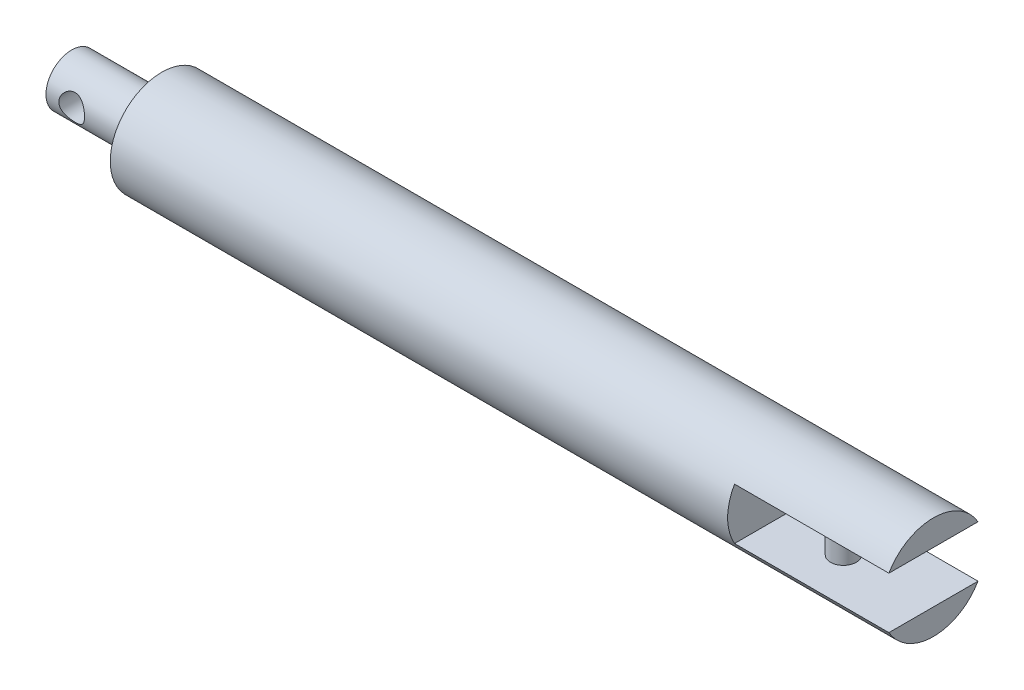
ISO-10303-21;
HEADER;
FILE_DESCRIPTION(('STEP AP214'),'2;1');
FILE_NAME('part.step','',(''),(''),'','','');
FILE_SCHEMA(('AUTOMOTIVE_DESIGN { 1 0 10303 214 1 1 1 1 }'));
ENDSEC;
DATA;
#1=APPLICATION_CONTEXT('core data for automotive mechanical design processes');
#2=APPLICATION_PROTOCOL_DEFINITION('international standard','automotive_design',2000,#1);
#3=PRODUCT_CONTEXT('',#1,'mechanical');
#4=PRODUCT('Part','Part','',(#3));
#5=PRODUCT_RELATED_PRODUCT_CATEGORY('part','',(#4));
#6=PRODUCT_DEFINITION_FORMATION('','',#4);
#7=PRODUCT_DEFINITION_CONTEXT('part definition',#1,'design');
#8=PRODUCT_DEFINITION('design','',#6,#7);
#9=PRODUCT_DEFINITION_SHAPE('','',#8);
#10=(LENGTH_UNIT() NAMED_UNIT(*) SI_UNIT(.MILLI.,.METRE.));
#11=(NAMED_UNIT(*) PLANE_ANGLE_UNIT() SI_UNIT($,.RADIAN.));
#12=(NAMED_UNIT(*) SI_UNIT($,.STERADIAN.) SOLID_ANGLE_UNIT());
#13=UNCERTAINTY_MEASURE_WITH_UNIT(LENGTH_MEASURE(1.E-05),#10,'distance_accuracy_value','');
#14=(GEOMETRIC_REPRESENTATION_CONTEXT(3) GLOBAL_UNCERTAINTY_ASSIGNED_CONTEXT((#13)) GLOBAL_UNIT_ASSIGNED_CONTEXT((#10,
#11,#12)) REPRESENTATION_CONTEXT('',''));
#15=CARTESIAN_POINT('',(0.,0.,0.));
#16=DIRECTION('',(0.,0.,1.));
#17=DIRECTION('',(1.,0.,0.));
#18=AXIS2_PLACEMENT_3D('',#15,#16,#17);
#19=CARTESIAN_POINT('',(67.,0.,0.));
#20=DIRECTION('',(1.,0.,0.));
#21=DIRECTION('',(0.,0.,-1.));
#22=AXIS2_PLACEMENT_3D('',#19,#20,#21);
#23=PLANE('',#22);
#24=DIRECTION('',(0.,0.,1.));
#25=VECTOR('',#24,1.);
#26=CARTESIAN_POINT('',(67.,2.,0.));
#27=LINE('',#26,#25);
#28=CARTESIAN_POINT('',(67.,2.,-3.46410161513775));
#29=VERTEX_POINT('',#28);
#30=CARTESIAN_POINT('',(67.,2.,3.46410161513775));
#31=VERTEX_POINT('',#30);
#32=EDGE_CURVE('E83',#29,#31,#27,.T.);
#33=ORIENTED_EDGE('',*,*,#32,.F.);
#34=CARTESIAN_POINT('',(67.,0.,0.));
#35=DIRECTION('',(1.,0.,0.));
#36=DIRECTION('',(0.,0.,-1.));
#37=AXIS2_PLACEMENT_3D('',#34,#35,#36);
#38=CIRCLE('',#37,4.);
#39=EDGE_CURVE('E97',#29,#31,#38,.T.);
#40=ORIENTED_EDGE('',*,*,#39,.T.);
#41=EDGE_LOOP('',(#33,#40));
#42=FACE_BOUND('',#41,.T.);
#43=ADVANCED_FACE('F34',(#42),#23,.T.);
#44=CARTESIAN_POINT('',(7.,0.,0.));
#45=DIRECTION('',(-1.,0.,0.));
#46=DIRECTION('',(0.,0.,1.));
#47=AXIS2_PLACEMENT_3D('',#44,#45,#46);
#48=CYLINDRICAL_SURFACE('',#47,2.);
#49=CARTESIAN_POINT('',(3.,0.,-2.));
#50=CARTESIAN_POINT('',(2.9999966976805,0.0525719629529865,-1.99999713404151));
#51=CARTESIAN_POINT('',(2.99582992687833,0.105206599698033,-1.99790491019518));
#52=CARTESIAN_POINT('',(2.97934711965908,0.208920235268425,-1.98974156037396));
#53=CARTESIAN_POINT('',(2.96701560700235,0.259996086713504,-1.98366287828984));
#54=CARTESIAN_POINT('',(2.93480619138321,0.358933544880574,-1.96816279403312));
#55=CARTESIAN_POINT('',(2.91495761575199,0.40680680293918,-1.9587543917752));
#56=CARTESIAN_POINT('',(2.86842937863506,0.498472616806565,-1.93745776515779));
#57=CARTESIAN_POINT('',(2.84175025575115,0.54226549399005,-1.9255697363353));
#58=CARTESIAN_POINT('',(2.7804827505147,0.627507817761919,-1.89956258258057));
#59=CARTESIAN_POINT('',(2.74551352076036,0.668655211122112,-1.88535199127536));
#60=CARTESIAN_POINT('',(2.66947852075297,0.744779444866977,-1.85659970246744));
#61=CARTESIAN_POINT('',(2.62840814822756,0.779751583106767,-1.84205776209035));
#62=CARTESIAN_POINT('',(2.53751665047662,0.845252000450279,-1.81298951197347));
#63=CARTESIAN_POINT('',(2.48726390165409,0.875225335551638,-1.79855186970132));
#64=CARTESIAN_POINT('',(2.38163266401378,0.926168226890696,-1.77285978772321));
#65=CARTESIAN_POINT('',(2.32625787127725,0.947144214966334,-1.7616030760699));
#66=CARTESIAN_POINT('',(2.21533489457808,0.978132442188589,-1.74457867037809));
#67=CARTESIAN_POINT('',(2.15999554793261,0.988725857080441,-1.73852271583714));
#68=CARTESIAN_POINT('',(2.04802116222052,1.00042699330885,-1.73181889948528));
#69=CARTESIAN_POINT('',(1.99138745912885,1.00154408837307,-1.73116569343288));
#70=CARTESIAN_POINT('',(1.88571397568463,0.994687287172295,-1.73510930257249));
#71=CARTESIAN_POINT('',(1.83657596877695,0.987784559536822,-1.73908763662014));
#72=CARTESIAN_POINT('',(1.74027809062696,0.966939849056932,-1.7507622873385));
#73=CARTESIAN_POINT('',(1.69311885469468,0.952995623897652,-1.75845978831776));
#74=CARTESIAN_POINT('',(1.60077086743434,0.918209780386004,-1.77687476412741));
#75=CARTESIAN_POINT('',(1.55565360121421,0.897215067115995,-1.78765840663999));
#76=CARTESIAN_POINT('',(1.46936570740999,0.849041687668003,-1.81103404281404));
#77=CARTESIAN_POINT('',(1.42819686439991,0.821860243812468,-1.82362684780191));
#78=CARTESIAN_POINT('',(1.34547874725677,0.758066054912789,-1.85113157903286));
#79=CARTESIAN_POINT('',(1.30454312642384,0.720694458369282,-1.86613510236746));
#80=CARTESIAN_POINT('',(1.2292645814091,0.639555578741374,-1.89547623300407));
#81=CARTESIAN_POINT('',(1.19492480796612,0.595785256574285,-1.90981351958801));
#82=CARTESIAN_POINT('',(1.13231433897027,0.500516505831848,-1.93701987282964));
#83=CARTESIAN_POINT('',(1.10439952755426,0.448753591599409,-1.94978984162008));
#84=CARTESIAN_POINT('',(1.05790297095699,0.340466215488797,-1.97157881121242));
#85=CARTESIAN_POINT('',(1.03931381498483,0.283945576265276,-1.98060078943553));
#86=CARTESIAN_POINT('',(1.01352459628332,0.172766491660702,-1.99324333741436));
#87=CARTESIAN_POINT('',(1.00550876425322,0.118341530548324,-1.99724938301312));
#88=CARTESIAN_POINT('',(0.99853526886551,0.00877959994935363,-2.00073013459102));
#89=CARTESIAN_POINT('',(0.999573314360521,-0.0463570198699014,-2.00020698721312));
#90=CARTESIAN_POINT('',(1.01020668841875,-0.151232971985994,-1.99491192253441));
#91=CARTESIAN_POINT('',(1.01913253273003,-0.201059408049954,-1.9904724568819));
#92=CARTESIAN_POINT('',(1.04423807189509,-0.298406892301917,-1.97822171314819));
#93=CARTESIAN_POINT('',(1.06041856645336,-0.345927685690997,-1.97041006334333));
#94=CARTESIAN_POINT('',(1.09999846643317,-0.438888608449665,-1.9518425141367));
#95=CARTESIAN_POINT('',(1.12359105011681,-0.484230397006154,-1.94100881769939));
#96=CARTESIAN_POINT('',(1.17710753564604,-0.570461361698921,-1.91743974317109));
#97=CARTESIAN_POINT('',(1.20703413459343,-0.611348629775282,-1.90470355565785));
#98=CARTESIAN_POINT('',(1.27576042533287,-0.691767689290653,-1.87708221337465));
#99=CARTESIAN_POINT('',(1.31514286845356,-0.730772077824639,-1.86210884848441));
#100=CARTESIAN_POINT('',(1.3999251512693,-0.80185632111324,-1.83262391603875));
#101=CARTESIAN_POINT('',(1.44532911881637,-0.833931385690841,-1.81811267381527));
#102=CARTESIAN_POINT('',(1.54364365420031,-0.891707914497696,-1.79051192226068));
#103=CARTESIAN_POINT('',(1.59681126620859,-0.917025495878638,-1.77752529663472));
#104=CARTESIAN_POINT('',(1.70751006769252,-0.958082826013803,-1.75574072368126));
#105=CARTESIAN_POINT('',(1.76503552650119,-0.97383491588757,-1.74693738240618));
#106=CARTESIAN_POINT('',(1.87691022286145,-0.993861687449679,-1.73561501008667));
#107=CARTESIAN_POINT('',(1.93103425342904,-0.999092996400865,-1.73257383460491));
#108=CARTESIAN_POINT('',(2.03944706717073,-1.00068915438079,-1.73165354646175));
#109=CARTESIAN_POINT('',(2.09373576873943,-0.997057846624399,-1.73377219627553));
#110=CARTESIAN_POINT('',(2.19548350153202,-0.981926125592263,-1.74237862050025));
#111=CARTESIAN_POINT('',(2.2431004701444,-0.971208314342799,-1.74843094482394));
#112=CARTESIAN_POINT('',(2.33580811942471,-0.943175358224645,-1.76371016187918));
#113=CARTESIAN_POINT('',(2.38089798209197,-0.92585809115981,-1.77293807569676));
#114=CARTESIAN_POINT('',(2.47062485098661,-0.883815745300683,-1.79428530364528));
#115=CARTESIAN_POINT('',(2.5150279018297,-0.858671137816458,-1.80655722396191));
#116=CARTESIAN_POINT('',(2.59927453618059,-0.802150971636634,-1.8323533163459));
#117=CARTESIAN_POINT('',(2.63911573051849,-0.770772171238648,-1.84587813794522));
#118=CARTESIAN_POINT('',(2.71814198235762,-0.698203326664641,-1.87462323159313));
#119=CARTESIAN_POINT('',(2.75665910236192,-0.656284423010171,-1.88984983311469));
#120=CARTESIAN_POINT('',(2.82626298342363,-0.56615480622028,-1.91877752255088));
#121=CARTESIAN_POINT('',(2.85734573942629,-0.517940723256785,-1.9324777860804));
#122=CARTESIAN_POINT('',(2.9112363627622,-0.415931596819947,-1.95698009585103));
#123=CARTESIAN_POINT('',(2.93398416941143,-0.362099503934614,-1.96776096562909));
#124=CARTESIAN_POINT('',(2.96980816791895,-0.250742101294191,-1.98501341363466));
#125=CARTESIAN_POINT('',(2.98291184682958,-0.193227799623166,-1.99149723372932));
#126=CARTESIAN_POINT('',(2.99389741107585,-0.112601946483384,-1.99695461909663));
#127=CARTESIAN_POINT('',(2.99618264086362,-0.0901618794394987,-1.99809365339202));
#128=CARTESIAN_POINT('',(2.99923466551681,-0.0451517318071577,-1.99961696977865));
#129=CARTESIAN_POINT('',(3.0000014184712,-0.0225816476473814,-2.00000123103763));
#130=CARTESIAN_POINT('',(3.,0.,-2.));
#131=B_SPLINE_CURVE_WITH_KNOTS('',3,(#49,#50,#51,#52,#53,#54,#55,#56,#57,#58,#59,#60,#61,#62,
#63,#64,#65,#66,#67,#68,#69,#70,#71,#72,#73,#74,#75,#76,#77,#78,#79,#80,#81,#82,#83,#84,#85,#86,
#87,#88,#89,#90,#91,#92,#93,#94,#95,#96,#97,#98,#99,#100,#101,#102,#103,#104,#105,#106,#107,
#108,#109,#110,#111,#112,#113,#114,#115,#116,#117,#118,#119,#120,#121,#122,#123,#124,#125,#126,
#127,#128,#129,#130),.UNSPECIFIED.,.T.,.F.,(4,2,2,2,2,2,2,2,2,2,2,2,2,2,2,2,2,2,2,2,2,2,2,2,2,2,
2,2,2,2,2,2,2,2,2,2,2,2,2,2,4),(0.,0.157624257420293,0.315548149709198,0.472862155492298,
0.630163760581568,0.796981758718089,0.963926237654036,1.14381726430753,1.32357947898281,
1.4925801214023,1.6614135732902,1.81005712409321,1.95874803925678,2.11090240168487,
2.26312521260222,2.43464941333878,2.60625534598686,2.78583022214441,2.9652621691228,
3.12983290471346,3.29432564511476,3.44606906506122,3.59782921630932,3.75392856027899,
3.91009450748339,4.08159610644419,4.25321588615432,4.43314682159674,4.61284511940778,
4.77529307498373,4.93767059860005,5.08457930244183,5.23153528783678,5.38836456775614,
5.54527561138958,5.72125242752498,5.89732383376573,6.07464013662925,6.2514490862493,
6.31915280137698,6.38685838514847),.UNSPECIFIED.);
#132=CARTESIAN_POINT('',(3.,0.,-2.));
#133=VERTEX_POINT('',#132);
#134=EDGE_CURVE('E84',#133,#133,#131,.T.);
#135=ORIENTED_EDGE('',*,*,#134,.T.);
#136=EDGE_LOOP('',(#135));
#137=FACE_BOUND('',#136,.T.);
#138=CARTESIAN_POINT('',(3.,0.,2.));
#139=CARTESIAN_POINT('',(2.9999966976805,-0.0525719629529866,1.99999713404151));
#140=CARTESIAN_POINT('',(2.99582992687833,-0.105206599698033,1.99790491019518));
#141=CARTESIAN_POINT('',(2.97934711965908,-0.208920235268425,1.98974156037396));
#142=CARTESIAN_POINT('',(2.96701560700235,-0.259996086713504,1.98366287828984));
#143=CARTESIAN_POINT('',(2.93480619138321,-0.358933544880574,1.96816279403312));
#144=CARTESIAN_POINT('',(2.91495761575199,-0.40680680293918,1.9587543917752));
#145=CARTESIAN_POINT('',(2.86842937863506,-0.498472616806565,1.93745776515779));
#146=CARTESIAN_POINT('',(2.84175025575115,-0.54226549399005,1.9255697363353));
#147=CARTESIAN_POINT('',(2.7804827505147,-0.627507817761919,1.89956258258057));
#148=CARTESIAN_POINT('',(2.74551352076036,-0.668655211122112,1.88535199127536));
#149=CARTESIAN_POINT('',(2.66947852075297,-0.744779444866977,1.85659970246744));
#150=CARTESIAN_POINT('',(2.62840814822756,-0.779751583106767,1.84205776209035));
#151=CARTESIAN_POINT('',(2.53751665047662,-0.845252000450279,1.81298951197347));
#152=CARTESIAN_POINT('',(2.48726390165409,-0.875225335551638,1.79855186970132));
#153=CARTESIAN_POINT('',(2.38163266401379,-0.926168226890696,1.77285978772321));
#154=CARTESIAN_POINT('',(2.32625787127725,-0.947144214966334,1.7616030760699));
#155=CARTESIAN_POINT('',(2.21533489457808,-0.978132442188589,1.74457867037809));
#156=CARTESIAN_POINT('',(2.15999554793261,-0.988725857080441,1.73852271583714));
#157=CARTESIAN_POINT('',(2.04802116222052,-1.00042699330885,1.73181889948528));
#158=CARTESIAN_POINT('',(1.99138745912885,-1.00154408837307,1.73116569343288));
#159=CARTESIAN_POINT('',(1.88571397568463,-0.994687287172295,1.73510930257249));
#160=CARTESIAN_POINT('',(1.83657596877695,-0.987784559536822,1.73908763662014));
#161=CARTESIAN_POINT('',(1.74027809062696,-0.966939849056932,1.7507622873385));
#162=CARTESIAN_POINT('',(1.69311885469468,-0.952995623897652,1.75845978831776));
#163=CARTESIAN_POINT('',(1.60077086743434,-0.918209780386004,1.77687476412741));
#164=CARTESIAN_POINT('',(1.55565360121421,-0.897215067115995,1.78765840663999));
#165=CARTESIAN_POINT('',(1.46936570740999,-0.849041687668003,1.81103404281404));
#166=CARTESIAN_POINT('',(1.42819686439991,-0.821860243812468,1.82362684780191));
#167=CARTESIAN_POINT('',(1.34547874725677,-0.758066054912789,1.85113157903286));
#168=CARTESIAN_POINT('',(1.30454312642384,-0.720694458369282,1.86613510236746));
#169=CARTESIAN_POINT('',(1.2292645814091,-0.639555578741373,1.89547623300407));
#170=CARTESIAN_POINT('',(1.19492480796612,-0.595785256574285,1.90981351958801));
#171=CARTESIAN_POINT('',(1.13231433897027,-0.500516505831848,1.93701987282964));
#172=CARTESIAN_POINT('',(1.10439952755426,-0.448753591599409,1.94978984162008));
#173=CARTESIAN_POINT('',(1.05790297095699,-0.340466215488797,1.97157881121242));
#174=CARTESIAN_POINT('',(1.03931381498483,-0.283945576265276,1.98060078943553));
#175=CARTESIAN_POINT('',(1.01352459628332,-0.172766491660702,1.99324333741436));
#176=CARTESIAN_POINT('',(1.00550876425322,-0.118341530548324,1.99724938301312));
#177=CARTESIAN_POINT('',(0.99853526886551,-0.00877959994935378,2.00073013459102));
#178=CARTESIAN_POINT('',(0.999573314360521,0.0463570198699013,2.00020698721312));
#179=CARTESIAN_POINT('',(1.01020668841875,0.151232971985994,1.99491192253441));
#180=CARTESIAN_POINT('',(1.01913253273003,0.201059408049954,1.9904724568819));
#181=CARTESIAN_POINT('',(1.04423807189509,0.298406892301917,1.97822171314819));
#182=CARTESIAN_POINT('',(1.06041856645336,0.345927685690997,1.97041006334333));
#183=CARTESIAN_POINT('',(1.09999846643317,0.438888608449665,1.9518425141367));
#184=CARTESIAN_POINT('',(1.12359105011681,0.484230397006154,1.94100881769939));
#185=CARTESIAN_POINT('',(1.17710753564604,0.570461361698921,1.91743974317109));
#186=CARTESIAN_POINT('',(1.20703413459343,0.611348629775282,1.90470355565785));
#187=CARTESIAN_POINT('',(1.27576042533287,0.691767689290653,1.87708221337465));
#188=CARTESIAN_POINT('',(1.31514286845356,0.730772077824639,1.86210884848441));
#189=CARTESIAN_POINT('',(1.3999251512693,0.80185632111324,1.83262391603875));
#190=CARTESIAN_POINT('',(1.44532911881637,0.833931385690841,1.81811267381527));
#191=CARTESIAN_POINT('',(1.54364365420031,0.891707914497696,1.79051192226068));
#192=CARTESIAN_POINT('',(1.59681126620859,0.917025495878638,1.77752529663472));
#193=CARTESIAN_POINT('',(1.70751006769252,0.958082826013803,1.75574072368126));
#194=CARTESIAN_POINT('',(1.76503552650119,0.97383491588757,1.74693738240618));
#195=CARTESIAN_POINT('',(1.87691022286145,0.993861687449679,1.73561501008667));
#196=CARTESIAN_POINT('',(1.93103425342904,0.999092996400865,1.73257383460491));
#197=CARTESIAN_POINT('',(2.03944706717073,1.00068915438079,1.73165354646175));
#198=CARTESIAN_POINT('',(2.09373576873943,0.997057846624399,1.73377219627553));
#199=CARTESIAN_POINT('',(2.19548350153202,0.981926125592263,1.74237862050025));
#200=CARTESIAN_POINT('',(2.2431004701444,0.971208314342799,1.74843094482394));
#201=CARTESIAN_POINT('',(2.33580811942471,0.943175358224645,1.76371016187918));
#202=CARTESIAN_POINT('',(2.38089798209197,0.92585809115981,1.77293807569676));
#203=CARTESIAN_POINT('',(2.47062485098661,0.883815745300683,1.79428530364528));
#204=CARTESIAN_POINT('',(2.5150279018297,0.858671137816458,1.80655722396191));
#205=CARTESIAN_POINT('',(2.59927453618059,0.802150971636634,1.8323533163459));
#206=CARTESIAN_POINT('',(2.63911573051849,0.770772171238648,1.84587813794522));
#207=CARTESIAN_POINT('',(2.71814198235762,0.698203326664641,1.87462323159313));
#208=CARTESIAN_POINT('',(2.75665910236192,0.656284423010171,1.88984983311469));
#209=CARTESIAN_POINT('',(2.82626298342363,0.56615480622028,1.91877752255088));
#210=CARTESIAN_POINT('',(2.85734573942629,0.517940723256785,1.9324777860804));
#211=CARTESIAN_POINT('',(2.9112363627622,0.415931596819947,1.95698009585103));
#212=CARTESIAN_POINT('',(2.93398416941143,0.362099503934614,1.96776096562909));
#213=CARTESIAN_POINT('',(2.96980816791895,0.250742101294191,1.98501341363466));
#214=CARTESIAN_POINT('',(2.98291184682958,0.193227799623166,1.99149723372932));
#215=CARTESIAN_POINT('',(2.99389741107585,0.112601946483384,1.99695461909663));
#216=CARTESIAN_POINT('',(2.99618264086362,0.0901618794394987,1.99809365339202));
#217=CARTESIAN_POINT('',(2.99923466551681,0.0451517318071577,1.99961696977865));
#218=CARTESIAN_POINT('',(3.0000014184712,0.0225816476473814,2.00000123103763));
#219=CARTESIAN_POINT('',(3.,0.,2.));
#220=B_SPLINE_CURVE_WITH_KNOTS('',3,(#138,#139,#140,#141,#142,#143,#144,#145,#146,#147,#148,
#149,#150,#151,#152,#153,#154,#155,#156,#157,#158,#159,#160,#161,#162,#163,#164,#165,#166,#167,
#168,#169,#170,#171,#172,#173,#174,#175,#176,#177,#178,#179,#180,#181,#182,#183,#184,#185,#186,
#187,#188,#189,#190,#191,#192,#193,#194,#195,#196,#197,#198,#199,#200,#201,#202,#203,#204,#205,
#206,#207,#208,#209,#210,#211,#212,#213,#214,#215,#216,#217,#218,#219),.UNSPECIFIED.,.T.,.F.,(4,
2,2,2,2,2,2,2,2,2,2,2,2,2,2,2,2,2,2,2,2,2,2,2,2,2,2,2,2,2,2,2,2,2,2,2,2,2,2,2,4),(0.,
0.157624257420293,0.315548149709198,0.472862155492298,0.630163760581568,0.796981758718089,
0.963926237654035,1.14381726430753,1.32357947898281,1.4925801214023,1.6614135732902,
1.81005712409321,1.95874803925678,2.11090240168487,2.26312521260222,2.43464941333878,
2.60625534598686,2.78583022214441,2.9652621691228,3.12983290471346,3.29432564511476,
3.44606906506122,3.59782921630932,3.75392856027899,3.91009450748339,4.08159610644419,
4.25321588615432,4.43314682159674,4.61284511940778,4.77529307498373,4.93767059860005,
5.08457930244183,5.23153528783678,5.38836456775614,5.54527561138958,5.72125242752498,
5.89732383376573,6.07464013662925,6.2514490862493,6.31915280137698,6.38685838514847),.UNSPECIFIED.);
#221=CARTESIAN_POINT('',(3.,0.,2.));
#222=VERTEX_POINT('',#221);
#223=EDGE_CURVE('E111',#222,#222,#220,.T.);
#224=ORIENTED_EDGE('',*,*,#223,.T.);
#225=EDGE_LOOP('',(#224));
#226=FACE_BOUND('',#225,.T.);
#227=CARTESIAN_POINT('',(7.,0.,0.));
#228=DIRECTION('',(1.,0.,0.));
#229=DIRECTION('',(0.,0.,-1.));
#230=AXIS2_PLACEMENT_3D('',#227,#228,#229);
#231=CIRCLE('',#230,2.);
#232=CARTESIAN_POINT('',(7.,0.,-2.));
#233=VERTEX_POINT('',#232);
#234=EDGE_CURVE('E108',#233,#233,#231,.T.);
#235=ORIENTED_EDGE('',*,*,#234,.F.);
#236=EDGE_LOOP('',(#235));
#237=FACE_BOUND('',#236,.T.);
#238=CARTESIAN_POINT('',(0.,0.,0.));
#239=DIRECTION('',(1.,0.,0.));
#240=DIRECTION('',(0.,0.,-1.));
#241=AXIS2_PLACEMENT_3D('',#238,#239,#240);
#242=CIRCLE('',#241,2.);
#243=CARTESIAN_POINT('',(0.,0.,-2.));
#244=VERTEX_POINT('',#243);
#245=EDGE_CURVE('E101',#244,#244,#242,.T.);
#246=ORIENTED_EDGE('',*,*,#245,.T.);
#247=EDGE_LOOP('',(#246));
#248=FACE_BOUND('',#247,.T.);
#249=ADVANCED_FACE('F36',(#137,#226,#237,#248),#48,.T.);
#250=CARTESIAN_POINT('',(0.,0.,0.));
#251=DIRECTION('',(1.,0.,0.));
#252=DIRECTION('',(0.,0.,-1.));
#253=AXIS2_PLACEMENT_3D('',#250,#251,#252);
#254=PLANE('',#253);
#255=ORIENTED_EDGE('',*,*,#245,.F.);
#256=EDGE_LOOP('',(#255));
#257=FACE_BOUND('',#256,.T.);
#258=ADVANCED_FACE('F127',(#257),#254,.F.);
#259=CARTESIAN_POINT('',(2.,0.,-2.));
#260=DIRECTION('',(0.,0.,1.));
#261=DIRECTION('',(1.,0.,0.));
#262=AXIS2_PLACEMENT_3D('',#259,#260,#261);
#263=CYLINDRICAL_SURFACE('',#262,1.);
#264=ORIENTED_EDGE('',*,*,#223,.F.);
#265=EDGE_LOOP('',(#264));
#266=FACE_BOUND('',#265,.T.);
#267=ORIENTED_EDGE('',*,*,#134,.F.);
#268=EDGE_LOOP('',(#267));
#269=FACE_BOUND('',#268,.T.);
#270=ADVANCED_FACE('F123',(#266,#269),#263,.F.);
#271=CARTESIAN_POINT('',(67.,0.,0.));
#272=DIRECTION('',(-1.,0.,0.));
#273=DIRECTION('',(0.,0.,1.));
#274=AXIS2_PLACEMENT_3D('',#271,#272,#273);
#275=CYLINDRICAL_SURFACE('',#274,4.);
#276=ORIENTED_EDGE('',*,*,#39,.F.);
#277=DIRECTION('',(-1.,0.,0.));
#278=VECTOR('',#277,1.);
#279=CARTESIAN_POINT('',(67.,2.,-3.46410161513775));
#280=LINE('',#279,#278);
#281=CARTESIAN_POINT('',(55.,2.,-3.46410161513775));
#282=VERTEX_POINT('',#281);
#283=EDGE_CURVE('E103',#29,#282,#280,.T.);
#284=ORIENTED_EDGE('',*,*,#283,.T.);
#285=CARTESIAN_POINT('',(55.,0.,0.));
#286=DIRECTION('',(-1.,0.,0.));
#287=DIRECTION('',(0.,0.,1.));
#288=AXIS2_PLACEMENT_3D('',#285,#286,#287);
#289=CIRCLE('',#288,4.);
#290=CARTESIAN_POINT('',(55.,-2.,-3.46410161513775));
#291=VERTEX_POINT('',#290);
#292=EDGE_CURVE('E93',#282,#291,#289,.T.);
#293=ORIENTED_EDGE('',*,*,#292,.T.);
#294=DIRECTION('',(-1.,0.,0.));
#295=VECTOR('',#294,1.);
#296=CARTESIAN_POINT('',(67.,-2.,-3.46410161513775));
#297=LINE('',#296,#295);
#298=CARTESIAN_POINT('',(67.,-2.,-3.46410161513775));
#299=VERTEX_POINT('',#298);
#300=EDGE_CURVE('E78',#291,#299,#297,.F.);
#301=ORIENTED_EDGE('',*,*,#300,.T.);
#302=CARTESIAN_POINT('',(67.,-2.,3.46410161513775));
#303=VERTEX_POINT('',#302);
#304=EDGE_CURVE('E91',#303,#299,#38,.T.);
#305=ORIENTED_EDGE('',*,*,#304,.F.);
#306=DIRECTION('',(-1.,0.,0.));
#307=VECTOR('',#306,1.);
#308=CARTESIAN_POINT('',(67.,-2.,3.46410161513775));
#309=LINE('',#308,#307);
#310=CARTESIAN_POINT('',(55.,-2.,3.46410161513775));
#311=VERTEX_POINT('',#310);
#312=EDGE_CURVE('E50',#303,#311,#309,.T.);
#313=ORIENTED_EDGE('',*,*,#312,.T.);
#314=CARTESIAN_POINT('',(55.,2.,3.46410161513775));
#315=VERTEX_POINT('',#314);
#316=EDGE_CURVE('E219',#311,#315,#289,.T.);
#317=ORIENTED_EDGE('',*,*,#316,.T.);
#318=DIRECTION('',(-1.,0.,0.));
#319=VECTOR('',#318,1.);
#320=CARTESIAN_POINT('',(67.,2.,3.46410161513775));
#321=LINE('',#320,#319);
#322=EDGE_CURVE('E58',#315,#31,#321,.F.);
#323=ORIENTED_EDGE('',*,*,#322,.T.);
#324=EDGE_LOOP('',(#276,#284,#293,#301,#305,#313,#317,#323));
#325=FACE_BOUND('',#324,.T.);
#326=CARTESIAN_POINT('',(7.,0.,0.));
#327=DIRECTION('',(1.,0.,0.));
#328=DIRECTION('',(0.,0.,-1.));
#329=AXIS2_PLACEMENT_3D('',#326,#327,#328);
#330=CIRCLE('',#329,4.);
#331=CARTESIAN_POINT('',(7.,0.,-4.));
#332=VERTEX_POINT('',#331);
#333=EDGE_CURVE('E98',#332,#332,#330,.T.);
#334=ORIENTED_EDGE('',*,*,#333,.T.);
#335=EDGE_LOOP('',(#334));
#336=FACE_BOUND('',#335,.T.);
#337=ADVANCED_FACE('F89',(#325,#336),#275,.T.);
#338=DIRECTION('',(0.,0.,-1.));
#339=VECTOR('',#338,1.);
#340=CARTESIAN_POINT('',(67.,-2.,0.));
#341=LINE('',#340,#339);
#342=EDGE_CURVE('E75',#303,#299,#341,.T.);
#343=ORIENTED_EDGE('',*,*,#342,.F.);
#344=ORIENTED_EDGE('',*,*,#304,.T.);
#345=EDGE_LOOP('',(#343,#344));
#346=FACE_BOUND('',#345,.T.);
#347=ADVANCED_FACE('F96',(#346),#23,.T.);
#348=CARTESIAN_POINT('',(7.,0.,0.));
#349=DIRECTION('',(1.,0.,0.));
#350=DIRECTION('',(0.,0.,-1.));
#351=AXIS2_PLACEMENT_3D('',#348,#349,#350);
#352=PLANE('',#351);
#353=ORIENTED_EDGE('',*,*,#234,.T.);
#354=EDGE_LOOP('',(#353));
#355=FACE_BOUND('',#354,.T.);
#356=ORIENTED_EDGE('',*,*,#333,.F.);
#357=EDGE_LOOP('',(#356));
#358=FACE_BOUND('',#357,.T.);
#359=ADVANCED_FACE('F146',(#355,#358),#352,.F.);
#360=CARTESIAN_POINT('',(55.,0.,0.));
#361=DIRECTION('',(-1.,0.,0.));
#362=DIRECTION('',(0.,0.,1.));
#363=AXIS2_PLACEMENT_3D('',#360,#361,#362);
#364=PLANE('',#363);
#365=DIRECTION('',(0.,0.,1.));
#366=VECTOR('',#365,1.);
#367=CARTESIAN_POINT('',(55.,2.,4.59402838512715));
#368=LINE('',#367,#366);
#369=EDGE_CURVE('E94',#282,#315,#368,.T.);
#370=ORIENTED_EDGE('',*,*,#369,.T.);
#371=ORIENTED_EDGE('',*,*,#316,.F.);
#372=DIRECTION('',(0.,0.,-1.));
#373=VECTOR('',#372,1.);
#374=CARTESIAN_POINT('',(55.,-2.,4.59402838512715));
#375=LINE('',#374,#373);
#376=EDGE_CURVE('E226',#311,#291,#375,.T.);
#377=ORIENTED_EDGE('',*,*,#376,.T.);
#378=ORIENTED_EDGE('',*,*,#292,.F.);
#379=EDGE_LOOP('',(#370,#371,#377,#378));
#380=FACE_BOUND('',#379,.T.);
#381=ADVANCED_FACE('F151',(#380),#364,.F.);
#382=CARTESIAN_POINT('',(55.,2.,4.59402838512715));
#383=DIRECTION('',(0.,1.,0.));
#384=DIRECTION('',(0.,0.,1.));
#385=AXIS2_PLACEMENT_3D('',#382,#383,#384);
#386=PLANE('',#385);
#387=CARTESIAN_POINT('',(60.,2.,0.));
#388=DIRECTION('',(0.,1.,0.));
#389=DIRECTION('',(0.,0.,1.));
#390=AXIS2_PLACEMENT_3D('',#387,#388,#389);
#391=CIRCLE('',#390,0.999999999999998);
#392=CARTESIAN_POINT('',(60.,2.,0.999999999999998));
#393=VERTEX_POINT('',#392);
#394=EDGE_CURVE('E11',#393,#393,#391,.F.);
#395=ORIENTED_EDGE('',*,*,#394,.F.);
#396=EDGE_LOOP('',(#395));
#397=FACE_BOUND('',#396,.T.);
#398=ORIENTED_EDGE('',*,*,#32,.T.);
#399=ORIENTED_EDGE('',*,*,#322,.F.);
#400=ORIENTED_EDGE('',*,*,#369,.F.);
#401=ORIENTED_EDGE('',*,*,#283,.F.);
#402=EDGE_LOOP('',(#398,#399,#400,#401));
#403=FACE_BOUND('',#402,.T.);
#404=ADVANCED_FACE('F184',(#397,#403),#386,.F.);
#405=CARTESIAN_POINT('',(55.,-2.,4.59402838512715));
#406=DIRECTION('',(0.,-1.,0.));
#407=DIRECTION('',(0.,0.,-1.));
#408=AXIS2_PLACEMENT_3D('',#405,#406,#407);
#409=PLANE('',#408);
#410=CARTESIAN_POINT('',(60.,-2.,0.));
#411=DIRECTION('',(0.,-1.,0.));
#412=DIRECTION('',(0.,0.,-1.));
#413=AXIS2_PLACEMENT_3D('',#410,#411,#412);
#414=CIRCLE('',#413,0.999999999999998);
#415=CARTESIAN_POINT('',(60.,-2.,-0.999999999999998));
#416=VERTEX_POINT('',#415);
#417=EDGE_CURVE('E43',#416,#416,#414,.F.);
#418=ORIENTED_EDGE('',*,*,#417,.F.);
#419=EDGE_LOOP('',(#418));
#420=FACE_BOUND('',#419,.T.);
#421=ORIENTED_EDGE('',*,*,#342,.T.);
#422=ORIENTED_EDGE('',*,*,#300,.F.);
#423=ORIENTED_EDGE('',*,*,#376,.F.);
#424=ORIENTED_EDGE('',*,*,#312,.F.);
#425=EDGE_LOOP('',(#421,#422,#423,#424));
#426=FACE_BOUND('',#425,.T.);
#427=ADVANCED_FACE('F77',(#420,#426),#409,.F.);
#428=CARTESIAN_POINT('',(60.,2.,0.));
#429=DIRECTION('',(0.,-1.,0.));
#430=DIRECTION('',(0.,0.,-1.));
#431=AXIS2_PLACEMENT_3D('',#428,#429,#430);
#432=CYLINDRICAL_SURFACE('',#431,0.999999999999998);
#433=ORIENTED_EDGE('',*,*,#394,.T.);
#434=EDGE_LOOP('',(#433));
#435=FACE_BOUND('',#434,.T.);
#436=ORIENTED_EDGE('',*,*,#417,.T.);
#437=EDGE_LOOP('',(#436));
#438=FACE_BOUND('',#437,.T.);
#439=ADVANCED_FACE('F201',(#435,#438),#432,.T.);
#440=CLOSED_SHELL('',(#43,#249,#258,#270,#337,#347,#359,#381,#404,#427,#439));
#441=MANIFOLD_SOLID_BREP('B2',#440);
#442=ADVANCED_BREP_SHAPE_REPRESENTATION('',(#18,#441),#14);
#443=SHAPE_DEFINITION_REPRESENTATION(#9,#442);
ENDSEC;
END-ISO-10303-21;
